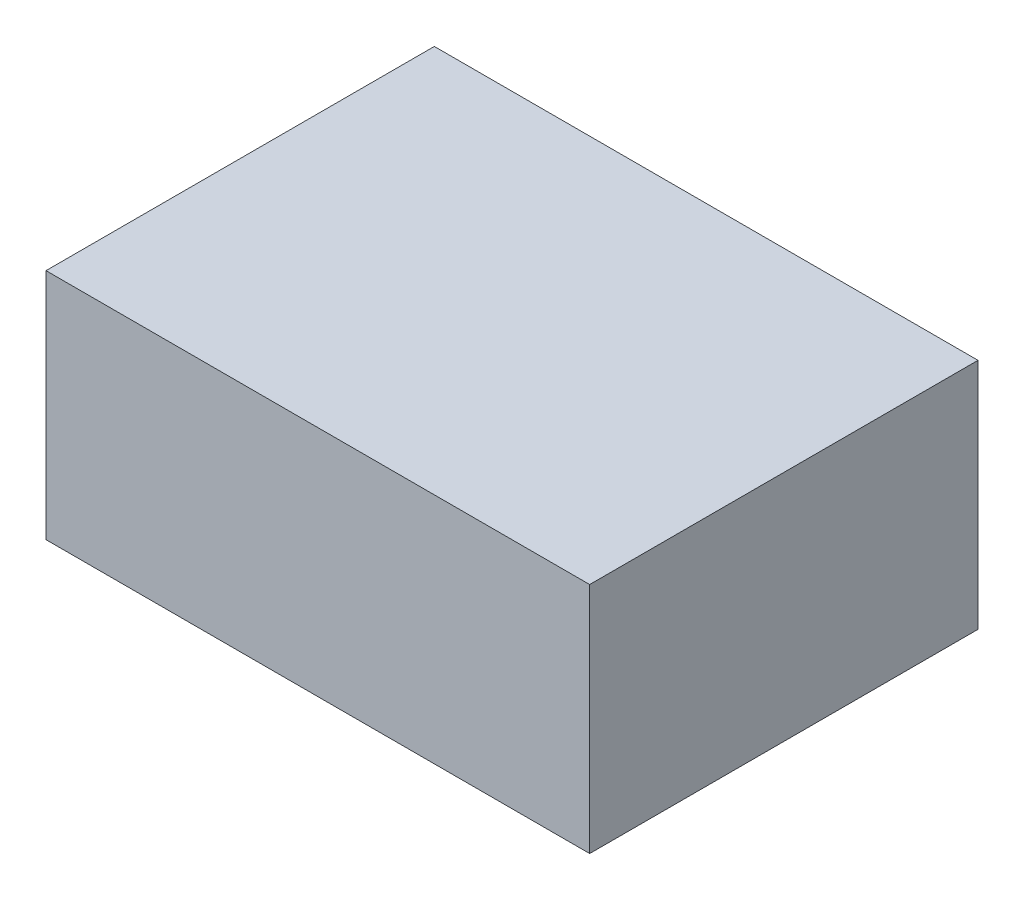
ISO-10303-21;
HEADER;
FILE_DESCRIPTION(('STEP AP214'),'2;1');
FILE_NAME('part.step','',(''),(''),'','','');
FILE_SCHEMA(('AUTOMOTIVE_DESIGN { 1 0 10303 214 1 1 1 1 }'));
ENDSEC;
DATA;
#1=APPLICATION_CONTEXT('core data for automotive mechanical design processes');
#2=APPLICATION_PROTOCOL_DEFINITION('international standard','automotive_design',2000,#1);
#3=PRODUCT_CONTEXT('',#1,'mechanical');
#4=PRODUCT('Part','Part','',(#3));
#5=PRODUCT_RELATED_PRODUCT_CATEGORY('part','',(#4));
#6=PRODUCT_DEFINITION_FORMATION('','',#4);
#7=PRODUCT_DEFINITION_CONTEXT('part definition',#1,'design');
#8=PRODUCT_DEFINITION('design','',#6,#7);
#9=PRODUCT_DEFINITION_SHAPE('','',#8);
#10=(LENGTH_UNIT() NAMED_UNIT(*) SI_UNIT(.MILLI.,.METRE.));
#11=(NAMED_UNIT(*) PLANE_ANGLE_UNIT() SI_UNIT($,.RADIAN.));
#12=(NAMED_UNIT(*) SI_UNIT($,.STERADIAN.) SOLID_ANGLE_UNIT());
#13=UNCERTAINTY_MEASURE_WITH_UNIT(LENGTH_MEASURE(1.E-05),#10,'distance_accuracy_value','');
#14=(GEOMETRIC_REPRESENTATION_CONTEXT(3) GLOBAL_UNCERTAINTY_ASSIGNED_CONTEXT((#13)) GLOBAL_UNIT_ASSIGNED_CONTEXT((#10,
#11,#12)) REPRESENTATION_CONTEXT('',''));
#15=CARTESIAN_POINT('',(0.,0.,0.));
#16=DIRECTION('',(0.,0.,1.));
#17=DIRECTION('',(1.,0.,0.));
#18=AXIS2_PLACEMENT_3D('',#15,#16,#17);
#19=CARTESIAN_POINT('',(0.,60.,0.));
#20=DIRECTION('',(1.,0.,0.));
#21=DIRECTION('',(0.,0.,-1.));
#22=AXIS2_PLACEMENT_3D('',#19,#20,#21);
#23=PLANE('',#22);
#24=DIRECTION('',(0.,0.,1.));
#25=VECTOR('',#24,1.);
#26=CARTESIAN_POINT('',(0.,0.,0.));
#27=LINE('',#26,#25);
#28=CARTESIAN_POINT('',(0.,0.,-100.));
#29=VERTEX_POINT('',#28);
#30=CARTESIAN_POINT('',(0.,0.,0.));
#31=VERTEX_POINT('',#30);
#32=EDGE_CURVE('E113',#29,#31,#27,.T.);
#33=ORIENTED_EDGE('',*,*,#32,.T.);
#34=DIRECTION('',(0.,-1.,0.));
#35=VECTOR('',#34,1.);
#36=CARTESIAN_POINT('',(0.,60.,0.));
#37=LINE('',#36,#35);
#38=CARTESIAN_POINT('',(0.,60.,0.));
#39=VERTEX_POINT('',#38);
#40=EDGE_CURVE('E11',#39,#31,#37,.T.);
#41=ORIENTED_EDGE('',*,*,#40,.F.);
#42=DIRECTION('',(0.,0.,1.));
#43=VECTOR('',#42,1.);
#44=CARTESIAN_POINT('',(0.,60.,0.));
#45=LINE('',#44,#43);
#46=CARTESIAN_POINT('',(0.,60.,-100.));
#47=VERTEX_POINT('',#46);
#48=EDGE_CURVE('E97',#47,#39,#45,.T.);
#49=ORIENTED_EDGE('',*,*,#48,.F.);
#50=DIRECTION('',(0.,-1.,0.));
#51=VECTOR('',#50,1.);
#52=CARTESIAN_POINT('',(0.,60.,-100.));
#53=LINE('',#52,#51);
#54=EDGE_CURVE('E109',#47,#29,#53,.T.);
#55=ORIENTED_EDGE('',*,*,#54,.T.);
#56=EDGE_LOOP('',(#33,#41,#49,#55));
#57=FACE_BOUND('',#56,.T.);
#58=ADVANCED_FACE('F45',(#57),#23,.F.);
#59=CARTESIAN_POINT('',(0.,60.,0.));
#60=DIRECTION('',(0.,0.,-1.));
#61=DIRECTION('',(-1.,0.,0.));
#62=AXIS2_PLACEMENT_3D('',#59,#60,#61);
#63=PLANE('',#62);
#64=DIRECTION('',(1.,0.,0.));
#65=VECTOR('',#64,1.);
#66=CARTESIAN_POINT('',(0.,0.,0.));
#67=LINE('',#66,#65);
#68=CARTESIAN_POINT('',(140.,0.,0.));
#69=VERTEX_POINT('',#68);
#70=EDGE_CURVE('E102',#31,#69,#67,.T.);
#71=ORIENTED_EDGE('',*,*,#70,.T.);
#72=DIRECTION('',(0.,-1.,0.));
#73=VECTOR('',#72,1.);
#74=CARTESIAN_POINT('',(140.,60.,0.));
#75=LINE('',#74,#73);
#76=CARTESIAN_POINT('',(140.,60.,0.));
#77=VERTEX_POINT('',#76);
#78=EDGE_CURVE('E54',#77,#69,#75,.T.);
#79=ORIENTED_EDGE('',*,*,#78,.F.);
#80=DIRECTION('',(1.,0.,0.));
#81=VECTOR('',#80,1.);
#82=CARTESIAN_POINT('',(0.,60.,0.));
#83=LINE('',#82,#81);
#84=EDGE_CURVE('E92',#39,#77,#83,.T.);
#85=ORIENTED_EDGE('',*,*,#84,.F.);
#86=ORIENTED_EDGE('',*,*,#40,.T.);
#87=EDGE_LOOP('',(#71,#79,#85,#86));
#88=FACE_BOUND('',#87,.T.);
#89=ADVANCED_FACE('F101',(#88),#63,.F.);
#90=CARTESIAN_POINT('',(140.,60.,0.));
#91=DIRECTION('',(-1.,0.,0.));
#92=DIRECTION('',(0.,0.,1.));
#93=AXIS2_PLACEMENT_3D('',#90,#91,#92);
#94=PLANE('',#93);
#95=DIRECTION('',(0.,0.,-1.));
#96=VECTOR('',#95,1.);
#97=CARTESIAN_POINT('',(140.,0.,0.));
#98=LINE('',#97,#96);
#99=CARTESIAN_POINT('',(140.,0.,-100.));
#100=VERTEX_POINT('',#99);
#101=EDGE_CURVE('E79',#69,#100,#98,.T.);
#102=ORIENTED_EDGE('',*,*,#101,.T.);
#103=DIRECTION('',(0.,-1.,0.));
#104=VECTOR('',#103,1.);
#105=CARTESIAN_POINT('',(140.,60.,-100.));
#106=LINE('',#105,#104);
#107=CARTESIAN_POINT('',(140.,60.,-100.));
#108=VERTEX_POINT('',#107);
#109=EDGE_CURVE('E104',#108,#100,#106,.T.);
#110=ORIENTED_EDGE('',*,*,#109,.F.);
#111=DIRECTION('',(0.,0.,-1.));
#112=VECTOR('',#111,1.);
#113=CARTESIAN_POINT('',(140.,60.,0.));
#114=LINE('',#113,#112);
#115=EDGE_CURVE('E95',#77,#108,#114,.T.);
#116=ORIENTED_EDGE('',*,*,#115,.F.);
#117=ORIENTED_EDGE('',*,*,#78,.T.);
#118=EDGE_LOOP('',(#102,#110,#116,#117));
#119=FACE_BOUND('',#118,.T.);
#120=ADVANCED_FACE('F105',(#119),#94,.F.);
#121=CARTESIAN_POINT('',(0.,60.,-100.));
#122=DIRECTION('',(0.,0.,1.));
#123=DIRECTION('',(1.,0.,0.));
#124=AXIS2_PLACEMENT_3D('',#121,#122,#123);
#125=PLANE('',#124);
#126=DIRECTION('',(-1.,0.,0.));
#127=VECTOR('',#126,1.);
#128=CARTESIAN_POINT('',(0.,0.,-100.));
#129=LINE('',#128,#127);
#130=EDGE_CURVE('E85',#100,#29,#129,.T.);
#131=ORIENTED_EDGE('',*,*,#130,.T.);
#132=ORIENTED_EDGE('',*,*,#54,.F.);
#133=DIRECTION('',(-1.,0.,0.));
#134=VECTOR('',#133,1.);
#135=CARTESIAN_POINT('',(0.,60.,-100.));
#136=LINE('',#135,#134);
#137=EDGE_CURVE('E62',#108,#47,#136,.T.);
#138=ORIENTED_EDGE('',*,*,#137,.F.);
#139=ORIENTED_EDGE('',*,*,#109,.T.);
#140=EDGE_LOOP('',(#131,#132,#138,#139));
#141=FACE_BOUND('',#140,.T.);
#142=ADVANCED_FACE('F126',(#141),#125,.F.);
#143=CARTESIAN_POINT('',(0.,60.,0.));
#144=DIRECTION('',(0.,-1.,0.));
#145=DIRECTION('',(0.,0.,-1.));
#146=AXIS2_PLACEMENT_3D('',#143,#144,#145);
#147=PLANE('',#146);
#148=ORIENTED_EDGE('',*,*,#48,.T.);
#149=ORIENTED_EDGE('',*,*,#84,.T.);
#150=ORIENTED_EDGE('',*,*,#115,.T.);
#151=ORIENTED_EDGE('',*,*,#137,.T.);
#152=EDGE_LOOP('',(#148,#149,#150,#151));
#153=FACE_BOUND('',#152,.T.);
#154=ADVANCED_FACE('F93',(#153),#147,.F.);
#155=CARTESIAN_POINT('',(0.,0.,0.));
#156=DIRECTION('',(0.,-1.,0.));
#157=DIRECTION('',(0.,0.,-1.));
#158=AXIS2_PLACEMENT_3D('',#155,#156,#157);
#159=PLANE('',#158);
#160=ORIENTED_EDGE('',*,*,#32,.F.);
#161=ORIENTED_EDGE('',*,*,#130,.F.);
#162=ORIENTED_EDGE('',*,*,#101,.F.);
#163=ORIENTED_EDGE('',*,*,#70,.F.);
#164=EDGE_LOOP('',(#160,#161,#162,#163));
#165=FACE_BOUND('',#164,.T.);
#166=ADVANCED_FACE('F129',(#165),#159,.T.);
#167=CLOSED_SHELL('',(#58,#89,#120,#142,#154,#166));
#168=MANIFOLD_SOLID_BREP('B2',#167);
#169=ADVANCED_BREP_SHAPE_REPRESENTATION('',(#18,#168),#14);
#170=SHAPE_DEFINITION_REPRESENTATION(#9,#169);
ENDSEC;
END-ISO-10303-21;
